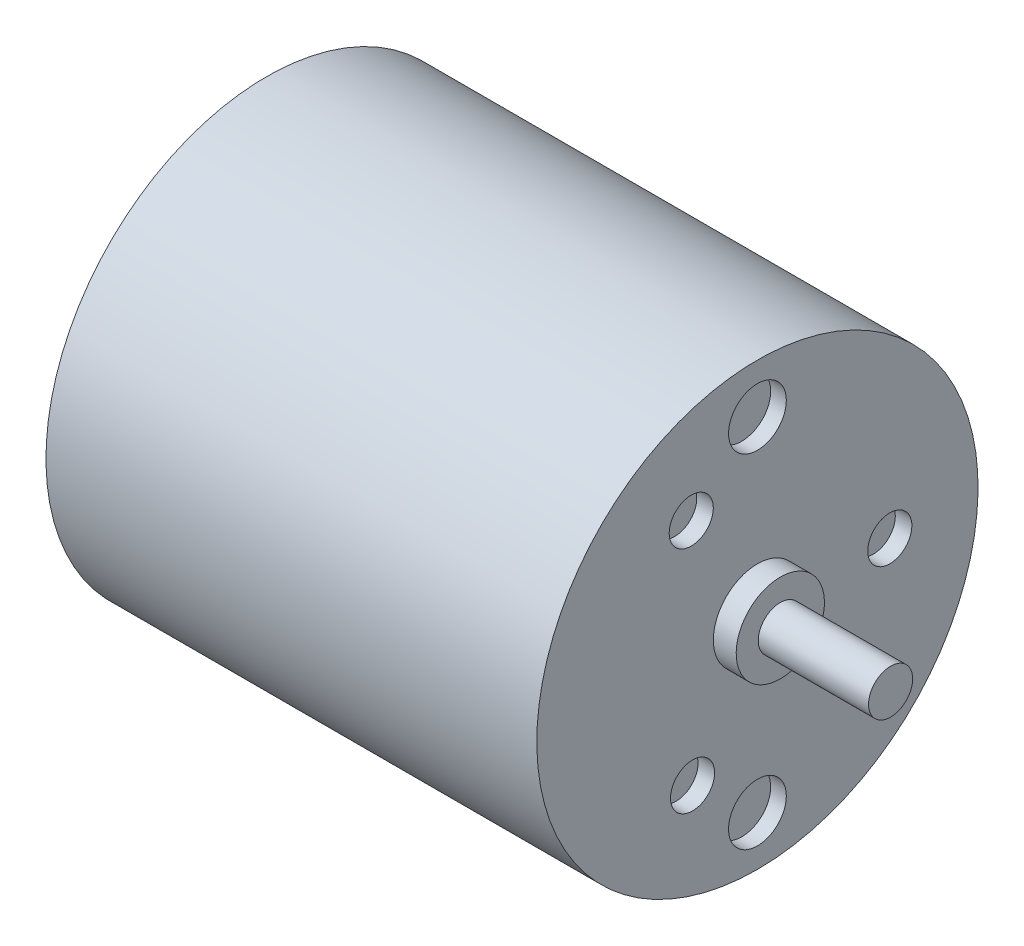
ISO-10303-21;
HEADER;
FILE_DESCRIPTION(('STEP AP214'),'2;1');
FILE_NAME('part.step','',(''),(''),'','','');
FILE_SCHEMA(('AUTOMOTIVE_DESIGN { 1 0 10303 214 1 1 1 1 }'));
ENDSEC;
DATA;
#1=APPLICATION_CONTEXT('core data for automotive mechanical design processes');
#2=APPLICATION_PROTOCOL_DEFINITION('international standard','automotive_design',2000,#1);
#3=PRODUCT_CONTEXT('',#1,'mechanical');
#4=PRODUCT('Part','Part','',(#3));
#5=PRODUCT_RELATED_PRODUCT_CATEGORY('part','',(#4));
#6=PRODUCT_DEFINITION_FORMATION('','',#4);
#7=PRODUCT_DEFINITION_CONTEXT('part definition',#1,'design');
#8=PRODUCT_DEFINITION('design','',#6,#7);
#9=PRODUCT_DEFINITION_SHAPE('','',#8);
#10=(LENGTH_UNIT() NAMED_UNIT(*) SI_UNIT(.MILLI.,.METRE.));
#11=(NAMED_UNIT(*) PLANE_ANGLE_UNIT() SI_UNIT($,.RADIAN.));
#12=(NAMED_UNIT(*) SI_UNIT($,.STERADIAN.) SOLID_ANGLE_UNIT());
#13=UNCERTAINTY_MEASURE_WITH_UNIT(LENGTH_MEASURE(1.E-05),#10,'distance_accuracy_value','');
#14=(GEOMETRIC_REPRESENTATION_CONTEXT(3) GLOBAL_UNCERTAINTY_ASSIGNED_CONTEXT((#13)) GLOBAL_UNIT_ASSIGNED_CONTEXT((#10,
#11,#12)) REPRESENTATION_CONTEXT('',''));
#15=CARTESIAN_POINT('',(0.,0.,0.));
#16=DIRECTION('',(0.,0.,1.));
#17=DIRECTION('',(1.,0.,0.));
#18=AXIS2_PLACEMENT_3D('',#15,#16,#17);
#19=CARTESIAN_POINT('',(14.8368644067797,0.,0.));
#20=DIRECTION('',(1.,0.,0.));
#21=DIRECTION('',(0.,1.,0.));
#22=AXIS2_PLACEMENT_3D('',#19,#20,#21);
#23=PLANE('',#22);
#24=CARTESIAN_POINT('',(14.8368644067797,-11.7005072215951,11.7625055217521));
#25=DIRECTION('',(1.,0.,0.));
#26=DIRECTION('',(0.,1.,0.));
#27=AXIS2_PLACEMENT_3D('',#24,#25,#26);
#28=CIRCLE('',#27,4.);
#29=CARTESIAN_POINT('',(14.8368644067797,-7.70050722159512,11.7625055217521));
#30=VERTEX_POINT('',#29);
#31=EDGE_CURVE('E266',#30,#30,#28,.T.);
#32=ORIENTED_EDGE('',*,*,#31,.F.);
#33=EDGE_LOOP('',(#32));
#34=FACE_BOUND('',#33,.T.);
#35=CARTESIAN_POINT('',(14.8368644067797,30.0040322934625,12.));
#36=DIRECTION('',(1.,0.,0.));
#37=DIRECTION('',(0.,1.,0.));
#38=AXIS2_PLACEMENT_3D('',#35,#36,#37);
#39=CIRCLE('',#38,4.);
#40=CARTESIAN_POINT('',(14.8368644067797,34.0040322934625,12.));
#41=VERTEX_POINT('',#40);
#42=EDGE_CURVE('E269',#41,#41,#39,.T.);
#43=ORIENTED_EDGE('',*,*,#42,.F.);
#44=EDGE_LOOP('',(#43));
#45=FACE_BOUND('',#44,.T.);
#46=CARTESIAN_POINT('',(14.8368644067797,9.21942260263592,-24.));
#47=DIRECTION('',(1.,0.,0.));
#48=DIRECTION('',(0.,1.,0.));
#49=AXIS2_PLACEMENT_3D('',#46,#47,#48);
#50=CIRCLE('',#49,4.);
#51=CARTESIAN_POINT('',(14.8368644067797,13.2194226026359,-24.));
#52=VERTEX_POINT('',#51);
#53=EDGE_CURVE('E276',#52,#52,#50,.T.);
#54=ORIENTED_EDGE('',*,*,#53,.F.);
#55=EDGE_LOOP('',(#54));
#56=FACE_BOUND('',#55,.T.);
#57=CARTESIAN_POINT('',(14.8368644067797,-21.8399236107824,0.));
#58=DIRECTION('',(1.,0.,0.));
#59=DIRECTION('',(0.,1.,0.));
#60=AXIS2_PLACEMENT_3D('',#57,#58,#59);
#61=CIRCLE('',#60,5.23656957102785);
#62=CARTESIAN_POINT('',(14.8368644067797,-16.6033540397546,0.));
#63=VERTEX_POINT('',#62);
#64=EDGE_CURVE('E66',#63,#63,#61,.F.);
#65=ORIENTED_EDGE('',*,*,#64,.T.);
#66=EDGE_LOOP('',(#65));
#67=FACE_BOUND('',#66,.T.);
#68=CARTESIAN_POINT('',(14.8368644067797,9.21942260263592,0.));
#69=DIRECTION('',(-1.,0.,0.));
#70=DIRECTION('',(0.,-1.,0.));
#71=AXIS2_PLACEMENT_3D('',#68,#69,#70);
#72=CIRCLE('',#71,8.);
#73=CARTESIAN_POINT('',(14.8368644067797,1.21942260263592,0.));
#74=VERTEX_POINT('',#73);
#75=EDGE_CURVE('E93',#74,#74,#72,.T.);
#76=ORIENTED_EDGE('',*,*,#75,.T.);
#77=EDGE_LOOP('',(#76));
#78=FACE_BOUND('',#77,.T.);
#79=CARTESIAN_POINT('',(14.8368644067797,9.21942260263592,0.));
#80=DIRECTION('',(-1.,0.,0.));
#81=DIRECTION('',(0.,-1.,0.));
#82=AXIS2_PLACEMENT_3D('',#79,#80,#81);
#83=CIRCLE('',#82,40.);
#84=CARTESIAN_POINT('',(14.8368644067797,-30.7805773973641,0.));
#85=VERTEX_POINT('',#84);
#86=EDGE_CURVE('E90',#85,#85,#83,.T.);
#87=ORIENTED_EDGE('',*,*,#86,.F.);
#88=EDGE_LOOP('',(#87));
#89=FACE_BOUND('',#88,.T.);
#90=CARTESIAN_POINT('',(14.8368644067797,40.2787688160543,0.));
#91=DIRECTION('',(1.,0.,0.));
#92=DIRECTION('',(0.,1.,0.));
#93=AXIS2_PLACEMENT_3D('',#90,#91,#92);
#94=CIRCLE('',#93,5.23656957102785);
#95=CARTESIAN_POINT('',(14.8368644067797,45.5153383870821,0.));
#96=VERTEX_POINT('',#95);
#97=EDGE_CURVE('E54',#96,#96,#94,.T.);
#98=ORIENTED_EDGE('',*,*,#97,.F.);
#99=EDGE_LOOP('',(#98));
#100=FACE_BOUND('',#99,.T.);
#101=ADVANCED_FACE('F50',(#34,#45,#56,#67,#78,#89,#100),#23,.T.);
#102=CARTESIAN_POINT('',(-107.444319021301,9.21942260263591,0.));
#103=DIRECTION('',(-1.,0.,0.));
#104=DIRECTION('',(0.,-1.,0.));
#105=AXIS2_PLACEMENT_3D('',#102,#103,#104);
#106=CYLINDRICAL_SURFACE('',#105,20.);
#107=CARTESIAN_POINT('',(-84.6631355932203,9.21942260263591,0.));
#108=DIRECTION('',(-1.,0.,0.));
#109=DIRECTION('',(0.,-1.,0.));
#110=AXIS2_PLACEMENT_3D('',#107,#108,#109);
#111=CIRCLE('',#110,20.);
#112=CARTESIAN_POINT('',(-84.6631355932203,-10.7805773973641,0.));
#113=VERTEX_POINT('',#112);
#114=EDGE_CURVE('E11',#113,#113,#111,.T.);
#115=ORIENTED_EDGE('',*,*,#114,.F.);
#116=EDGE_LOOP('',(#115));
#117=FACE_BOUND('',#116,.T.);
#118=CARTESIAN_POINT('',(-74.1631355932203,9.21942260263591,0.));
#119=DIRECTION('',(-1.,0.,0.));
#120=DIRECTION('',(0.,-1.,0.));
#121=AXIS2_PLACEMENT_3D('',#118,#119,#120);
#122=CIRCLE('',#121,20.);
#123=CARTESIAN_POINT('',(-74.1631355932203,-10.7805773973641,0.));
#124=VERTEX_POINT('',#123);
#125=EDGE_CURVE('E72',#124,#124,#122,.T.);
#126=ORIENTED_EDGE('',*,*,#125,.T.);
#127=EDGE_LOOP('',(#126));
#128=FACE_BOUND('',#127,.T.);
#129=ADVANCED_FACE('F52',(#117,#128),#106,.T.);
#130=CARTESIAN_POINT('',(-84.6631355932203,0.,0.));
#131=DIRECTION('',(1.,0.,0.));
#132=DIRECTION('',(0.,1.,0.));
#133=AXIS2_PLACEMENT_3D('',#130,#131,#132);
#134=PLANE('',#133);
#135=ORIENTED_EDGE('',*,*,#114,.T.);
#136=EDGE_LOOP('',(#135));
#137=FACE_BOUND('',#136,.T.);
#138=ADVANCED_FACE('F115',(#137),#134,.F.);
#139=CARTESIAN_POINT('',(38.9851694915253,0.,0.));
#140=DIRECTION('',(1.,0.,0.));
#141=DIRECTION('',(0.,1.,0.));
#142=AXIS2_PLACEMENT_3D('',#139,#140,#141);
#143=PLANE('',#142);
#144=CARTESIAN_POINT('',(38.9851694915254,9.21942260263592,0.));
#145=DIRECTION('',(-1.,0.,0.));
#146=DIRECTION('',(0.,-1.,0.));
#147=AXIS2_PLACEMENT_3D('',#144,#145,#146);
#148=CIRCLE('',#147,4.);
#149=CARTESIAN_POINT('',(38.9851694915254,5.21942260263592,0.));
#150=VERTEX_POINT('',#149);
#151=EDGE_CURVE('E58',#150,#150,#148,.T.);
#152=ORIENTED_EDGE('',*,*,#151,.F.);
#153=EDGE_LOOP('',(#152));
#154=FACE_BOUND('',#153,.T.);
#155=ADVANCED_FACE('F106',(#154),#143,.T.);
#156=CARTESIAN_POINT('',(-107.444319021301,9.21942260263591,0.));
#157=DIRECTION('',(-1.,0.,0.));
#158=DIRECTION('',(0.,-1.,0.));
#159=AXIS2_PLACEMENT_3D('',#156,#157,#158);
#160=CYLINDRICAL_SURFACE('',#159,4.);
#161=ORIENTED_EDGE('',*,*,#151,.T.);
#162=EDGE_LOOP('',(#161));
#163=FACE_BOUND('',#162,.T.);
#164=CARTESIAN_POINT('',(18.9851694915253,9.21942260263592,0.));
#165=DIRECTION('',(-1.,0.,0.));
#166=DIRECTION('',(0.,-1.,0.));
#167=AXIS2_PLACEMENT_3D('',#164,#165,#166);
#168=CIRCLE('',#167,4.);
#169=CARTESIAN_POINT('',(18.9851694915253,5.21942260263591,0.));
#170=VERTEX_POINT('',#169);
#171=EDGE_CURVE('E63',#170,#170,#168,.T.);
#172=ORIENTED_EDGE('',*,*,#171,.F.);
#173=EDGE_LOOP('',(#172));
#174=FACE_BOUND('',#173,.T.);
#175=ADVANCED_FACE('F104',(#163,#174),#160,.T.);
#176=CARTESIAN_POINT('',(18.9851694915254,0.,0.));
#177=DIRECTION('',(1.,0.,0.));
#178=DIRECTION('',(0.,1.,0.));
#179=AXIS2_PLACEMENT_3D('',#176,#177,#178);
#180=PLANE('',#179);
#181=ORIENTED_EDGE('',*,*,#171,.T.);
#182=EDGE_LOOP('',(#181));
#183=FACE_BOUND('',#182,.T.);
#184=CARTESIAN_POINT('',(18.9851694915253,9.21942260263592,0.));
#185=DIRECTION('',(-1.,0.,0.));
#186=DIRECTION('',(0.,-1.,0.));
#187=AXIS2_PLACEMENT_3D('',#184,#185,#186);
#188=CIRCLE('',#187,8.00000000000001);
#189=CARTESIAN_POINT('',(18.9851694915253,1.21942260263591,0.));
#190=VERTEX_POINT('',#189);
#191=EDGE_CURVE('E96',#190,#190,#188,.T.);
#192=ORIENTED_EDGE('',*,*,#191,.F.);
#193=EDGE_LOOP('',(#192));
#194=FACE_BOUND('',#193,.T.);
#195=ADVANCED_FACE('F101',(#183,#194),#180,.T.);
#196=CARTESIAN_POINT('',(-107.444319021301,9.21942260263591,0.));
#197=DIRECTION('',(-1.,0.,0.));
#198=DIRECTION('',(0.,-1.,0.));
#199=AXIS2_PLACEMENT_3D('',#196,#197,#198);
#200=CYLINDRICAL_SURFACE('',#199,8.);
#201=ORIENTED_EDGE('',*,*,#191,.T.);
#202=EDGE_LOOP('',(#201));
#203=FACE_BOUND('',#202,.T.);
#204=ORIENTED_EDGE('',*,*,#75,.F.);
#205=EDGE_LOOP('',(#204));
#206=FACE_BOUND('',#205,.T.);
#207=ADVANCED_FACE('F113',(#203,#206),#200,.T.);
#208=CARTESIAN_POINT('',(-107.444319021301,9.21942260263591,0.));
#209=DIRECTION('',(-1.,0.,0.));
#210=DIRECTION('',(0.,-1.,0.));
#211=AXIS2_PLACEMENT_3D('',#208,#209,#210);
#212=CYLINDRICAL_SURFACE('',#211,40.);
#213=ORIENTED_EDGE('',*,*,#86,.T.);
#214=EDGE_LOOP('',(#213));
#215=FACE_BOUND('',#214,.T.);
#216=CARTESIAN_POINT('',(-74.1631355932203,9.21942260263591,0.));
#217=DIRECTION('',(-1.,0.,0.));
#218=DIRECTION('',(0.,-1.,0.));
#219=AXIS2_PLACEMENT_3D('',#216,#217,#218);
#220=CIRCLE('',#219,40.);
#221=CARTESIAN_POINT('',(-74.1631355932203,-30.7805773973641,0.));
#222=VERTEX_POINT('',#221);
#223=EDGE_CURVE('E87',#222,#222,#220,.T.);
#224=ORIENTED_EDGE('',*,*,#223,.F.);
#225=EDGE_LOOP('',(#224));
#226=FACE_BOUND('',#225,.T.);
#227=ADVANCED_FACE('F129',(#215,#226),#212,.T.);
#228=CARTESIAN_POINT('',(-74.1631355932203,0.,0.));
#229=DIRECTION('',(1.,0.,0.));
#230=DIRECTION('',(0.,1.,0.));
#231=AXIS2_PLACEMENT_3D('',#228,#229,#230);
#232=PLANE('',#231);
#233=ORIENTED_EDGE('',*,*,#125,.F.);
#234=EDGE_LOOP('',(#233));
#235=FACE_BOUND('',#234,.T.);
#236=ORIENTED_EDGE('',*,*,#223,.T.);
#237=EDGE_LOOP('',(#236));
#238=FACE_BOUND('',#237,.T.);
#239=ADVANCED_FACE('F136',(#235,#238),#232,.F.);
#240=CARTESIAN_POINT('',(12.,-21.8399236107824,0.));
#241=DIRECTION('',(1.,0.,0.));
#242=DIRECTION('',(0.,0.,-1.));
#243=AXIS2_PLACEMENT_3D('',#240,#241,#242);
#244=CYLINDRICAL_SURFACE('',#243,5.23656957102785);
#245=ORIENTED_EDGE('',*,*,#64,.F.);
#246=EDGE_LOOP('',(#245));
#247=FACE_BOUND('',#246,.T.);
#248=CARTESIAN_POINT('',(12.,-21.8399236107824,0.));
#249=DIRECTION('',(-1.,0.,0.));
#250=DIRECTION('',(0.,0.,1.));
#251=AXIS2_PLACEMENT_3D('',#248,#249,#250);
#252=CIRCLE('',#251,5.23656957102785);
#253=CARTESIAN_POINT('',(12.,-21.8399236107824,5.23656957102785));
#254=VERTEX_POINT('',#253);
#255=EDGE_CURVE('E74',#254,#254,#252,.T.);
#256=ORIENTED_EDGE('',*,*,#255,.T.);
#257=EDGE_LOOP('',(#256));
#258=FACE_BOUND('',#257,.T.);
#259=ADVANCED_FACE('F159',(#247,#258),#244,.F.);
#260=CARTESIAN_POINT('',(12.,-21.8399236107824,0.));
#261=DIRECTION('',(-1.,0.,0.));
#262=DIRECTION('',(0.,0.,1.));
#263=AXIS2_PLACEMENT_3D('',#260,#261,#262);
#264=PLANE('',#263);
#265=ORIENTED_EDGE('',*,*,#255,.F.);
#266=EDGE_LOOP('',(#265));
#267=FACE_BOUND('',#266,.T.);
#268=ADVANCED_FACE('F151',(#267),#264,.F.);
#269=CARTESIAN_POINT('',(12.,40.2787688160543,0.));
#270=DIRECTION('',(1.,0.,0.));
#271=DIRECTION('',(0.,0.,-1.));
#272=AXIS2_PLACEMENT_3D('',#269,#270,#271);
#273=CYLINDRICAL_SURFACE('',#272,5.23656957102785);
#274=ORIENTED_EDGE('',*,*,#97,.T.);
#275=EDGE_LOOP('',(#274));
#276=FACE_BOUND('',#275,.T.);
#277=CARTESIAN_POINT('',(12.,40.2787688160543,0.));
#278=DIRECTION('',(1.,0.,0.));
#279=DIRECTION('',(0.,0.,-1.));
#280=AXIS2_PLACEMENT_3D('',#277,#278,#279);
#281=CIRCLE('',#280,5.23656957102785);
#282=CARTESIAN_POINT('',(12.,40.2787688160543,-5.23656957102785));
#283=VERTEX_POINT('',#282);
#284=EDGE_CURVE('E68',#283,#283,#281,.T.);
#285=ORIENTED_EDGE('',*,*,#284,.F.);
#286=EDGE_LOOP('',(#285));
#287=FACE_BOUND('',#286,.T.);
#288=ADVANCED_FACE('F147',(#276,#287),#273,.F.);
#289=CARTESIAN_POINT('',(12.,40.2787688160543,0.));
#290=DIRECTION('',(1.,0.,0.));
#291=DIRECTION('',(0.,0.,-1.));
#292=AXIS2_PLACEMENT_3D('',#289,#290,#291);
#293=PLANE('',#292);
#294=ORIENTED_EDGE('',*,*,#284,.T.);
#295=EDGE_LOOP('',(#294));
#296=FACE_BOUND('',#295,.T.);
#297=ADVANCED_FACE('F150',(#296),#293,.T.);
#298=CARTESIAN_POINT('',(11.8368644067797,9.21942260263592,-24.));
#299=DIRECTION('',(1.,0.,0.));
#300=DIRECTION('',(0.,1.,0.));
#301=AXIS2_PLACEMENT_3D('',#298,#299,#300);
#302=CYLINDRICAL_SURFACE('',#301,4.);
#303=CARTESIAN_POINT('',(11.8368644067797,9.21942260263592,-24.));
#304=DIRECTION('',(1.,0.,0.));
#305=DIRECTION('',(0.,1.,0.));
#306=AXIS2_PLACEMENT_3D('',#303,#304,#305);
#307=CIRCLE('',#306,4.);
#308=CARTESIAN_POINT('',(11.8368644067797,13.2194226026359,-24.));
#309=VERTEX_POINT('',#308);
#310=EDGE_CURVE('E82',#309,#309,#307,.T.);
#311=ORIENTED_EDGE('',*,*,#310,.F.);
#312=EDGE_LOOP('',(#311));
#313=FACE_BOUND('',#312,.T.);
#314=ORIENTED_EDGE('',*,*,#53,.T.);
#315=EDGE_LOOP('',(#314));
#316=FACE_BOUND('',#315,.T.);
#317=ADVANCED_FACE('F157',(#313,#316),#302,.F.);
#318=CARTESIAN_POINT('',(11.8368644067797,0.,0.));
#319=DIRECTION('',(1.,0.,0.));
#320=DIRECTION('',(0.,1.,0.));
#321=AXIS2_PLACEMENT_3D('',#318,#319,#320);
#322=PLANE('',#321);
#323=ORIENTED_EDGE('',*,*,#310,.T.);
#324=EDGE_LOOP('',(#323));
#325=FACE_BOUND('',#324,.T.);
#326=ADVANCED_FACE('F210',(#325),#322,.T.);
#327=CARTESIAN_POINT('',(11.8368644067797,30.0040322934625,12.));
#328=DIRECTION('',(1.,0.,0.));
#329=DIRECTION('',(0.,1.,0.));
#330=AXIS2_PLACEMENT_3D('',#327,#328,#329);
#331=CYLINDRICAL_SURFACE('',#330,4.);
#332=CARTESIAN_POINT('',(11.8368644067797,30.0040322934625,12.));
#333=DIRECTION('',(1.,0.,0.));
#334=DIRECTION('',(0.,1.,0.));
#335=AXIS2_PLACEMENT_3D('',#332,#333,#334);
#336=CIRCLE('',#335,4.);
#337=CARTESIAN_POINT('',(11.8368644067797,34.0040322934625,12.));
#338=VERTEX_POINT('',#337);
#339=EDGE_CURVE('E274',#338,#338,#336,.T.);
#340=ORIENTED_EDGE('',*,*,#339,.F.);
#341=EDGE_LOOP('',(#340));
#342=FACE_BOUND('',#341,.T.);
#343=ORIENTED_EDGE('',*,*,#42,.T.);
#344=EDGE_LOOP('',(#343));
#345=FACE_BOUND('',#344,.T.);
#346=ADVANCED_FACE('F220',(#342,#345),#331,.F.);
#347=CARTESIAN_POINT('',(11.8368644067797,0.,0.));
#348=DIRECTION('',(1.,0.,0.));
#349=DIRECTION('',(0.,1.,0.));
#350=AXIS2_PLACEMENT_3D('',#347,#348,#349);
#351=PLANE('',#350);
#352=ORIENTED_EDGE('',*,*,#339,.T.);
#353=EDGE_LOOP('',(#352));
#354=FACE_BOUND('',#353,.T.);
#355=ADVANCED_FACE('F230',(#354),#351,.T.);
#356=CARTESIAN_POINT('',(11.8368644067797,-11.7005072215951,11.7625055217521));
#357=DIRECTION('',(1.,0.,0.));
#358=DIRECTION('',(0.,1.,0.));
#359=AXIS2_PLACEMENT_3D('',#356,#357,#358);
#360=CYLINDRICAL_SURFACE('',#359,4.);
#361=CARTESIAN_POINT('',(11.8368644067797,-11.7005072215951,11.7625055217521));
#362=DIRECTION('',(1.,0.,0.));
#363=DIRECTION('',(0.,1.,0.));
#364=AXIS2_PLACEMENT_3D('',#361,#362,#363);
#365=CIRCLE('',#364,4.);
#366=CARTESIAN_POINT('',(11.8368644067797,-7.70050722159512,11.7625055217521));
#367=VERTEX_POINT('',#366);
#368=EDGE_CURVE('E79',#367,#367,#365,.T.);
#369=ORIENTED_EDGE('',*,*,#368,.F.);
#370=EDGE_LOOP('',(#369));
#371=FACE_BOUND('',#370,.T.);
#372=ORIENTED_EDGE('',*,*,#31,.T.);
#373=EDGE_LOOP('',(#372));
#374=FACE_BOUND('',#373,.T.);
#375=ADVANCED_FACE('F240',(#371,#374),#360,.F.);
#376=CARTESIAN_POINT('',(11.8368644067797,0.,0.));
#377=DIRECTION('',(1.,0.,0.));
#378=DIRECTION('',(0.,1.,0.));
#379=AXIS2_PLACEMENT_3D('',#376,#377,#378);
#380=PLANE('',#379);
#381=ORIENTED_EDGE('',*,*,#368,.T.);
#382=EDGE_LOOP('',(#381));
#383=FACE_BOUND('',#382,.T.);
#384=ADVANCED_FACE('F250',(#383),#380,.T.);
#385=CLOSED_SHELL('',(#101,#129,#138,#155,#175,#195,#207,#227,#239,#259,#268,#288,#297,#317,
#326,#346,#355,#375,#384));
#386=MANIFOLD_SOLID_BREP('B2',#385);
#387=ADVANCED_BREP_SHAPE_REPRESENTATION('',(#18,#386),#14);
#388=SHAPE_DEFINITION_REPRESENTATION(#9,#387);
ENDSEC;
END-ISO-10303-21;
